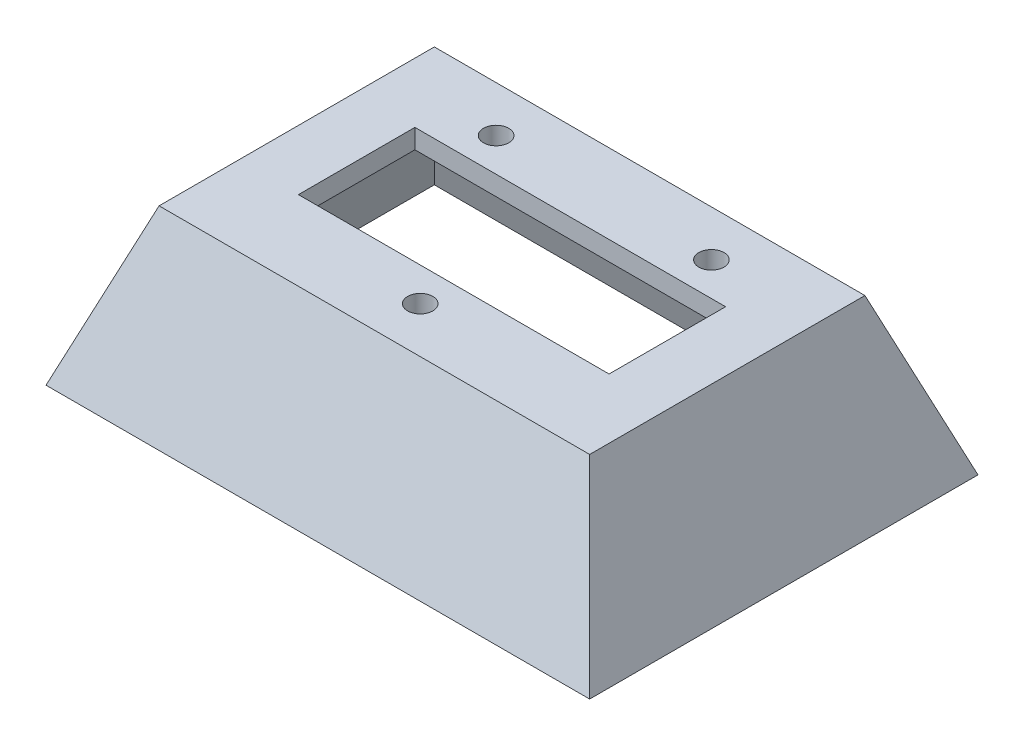
ISO-10303-21;
HEADER;
FILE_DESCRIPTION(('STEP AP214'),'2;1');
FILE_NAME('part.step','',(''),(''),'','','');
FILE_SCHEMA(('AUTOMOTIVE_DESIGN { 1 0 10303 214 1 1 1 1 }'));
ENDSEC;
DATA;
#1=APPLICATION_CONTEXT('core data for automotive mechanical design processes');
#2=APPLICATION_PROTOCOL_DEFINITION('international standard','automotive_design',2000,#1);
#3=PRODUCT_CONTEXT('',#1,'mechanical');
#4=PRODUCT('Part','Part','',(#3));
#5=PRODUCT_RELATED_PRODUCT_CATEGORY('part','',(#4));
#6=PRODUCT_DEFINITION_FORMATION('','',#4);
#7=PRODUCT_DEFINITION_CONTEXT('part definition',#1,'design');
#8=PRODUCT_DEFINITION('design','',#6,#7);
#9=PRODUCT_DEFINITION_SHAPE('','',#8);
#10=(LENGTH_UNIT() NAMED_UNIT(*) SI_UNIT(.MILLI.,.METRE.));
#11=(NAMED_UNIT(*) PLANE_ANGLE_UNIT() SI_UNIT($,.RADIAN.));
#12=(NAMED_UNIT(*) SI_UNIT($,.STERADIAN.) SOLID_ANGLE_UNIT());
#13=UNCERTAINTY_MEASURE_WITH_UNIT(LENGTH_MEASURE(1.E-05),#10,'distance_accuracy_value','');
#14=(GEOMETRIC_REPRESENTATION_CONTEXT(3) GLOBAL_UNCERTAINTY_ASSIGNED_CONTEXT((#13)) GLOBAL_UNIT_ASSIGNED_CONTEXT((#10,
#11,#12)) REPRESENTATION_CONTEXT('',''));
#15=CARTESIAN_POINT('',(0.,0.,0.));
#16=DIRECTION('',(0.,0.,1.));
#17=DIRECTION('',(1.,0.,0.));
#18=AXIS2_PLACEMENT_3D('',#15,#16,#17);
#19=CARTESIAN_POINT('',(0.,0.,0.));
#20=DIRECTION('',(0.,-1.,0.));
#21=DIRECTION('',(0.,0.,-1.));
#22=AXIS2_PLACEMENT_3D('',#19,#20,#21);
#23=PLANE('',#22);
#24=DIRECTION('',(0.,0.,-1.));
#25=VECTOR('',#24,1.);
#26=CARTESIAN_POINT('',(70.,0.,50.));
#27=LINE('',#26,#25);
#28=CARTESIAN_POINT('',(70.,0.,50.));
#29=VERTEX_POINT('',#28);
#30=CARTESIAN_POINT('',(70.,0.,-50.));
#31=VERTEX_POINT('',#30);
#32=EDGE_CURVE('E154',#29,#31,#27,.T.);
#33=ORIENTED_EDGE('',*,*,#32,.F.);
#34=DIRECTION('',(1.,0.,0.));
#35=VECTOR('',#34,1.);
#36=CARTESIAN_POINT('',(-70.,0.,50.));
#37=LINE('',#36,#35);
#38=CARTESIAN_POINT('',(-70.,0.,50.));
#39=VERTEX_POINT('',#38);
#40=EDGE_CURVE('E189',#39,#29,#37,.T.);
#41=ORIENTED_EDGE('',*,*,#40,.F.);
#42=DIRECTION('',(0.,0.,1.));
#43=VECTOR('',#42,1.);
#44=CARTESIAN_POINT('',(-70.,0.,50.));
#45=LINE('',#44,#43);
#46=CARTESIAN_POINT('',(-70.,0.,-50.));
#47=VERTEX_POINT('',#46);
#48=EDGE_CURVE('E187',#47,#39,#45,.T.);
#49=ORIENTED_EDGE('',*,*,#48,.F.);
#50=DIRECTION('',(-1.,0.,0.));
#51=VECTOR('',#50,1.);
#52=CARTESIAN_POINT('',(-70.,0.,-50.));
#53=LINE('',#52,#51);
#54=EDGE_CURVE('E185',#31,#47,#53,.T.);
#55=ORIENTED_EDGE('',*,*,#54,.F.);
#56=EDGE_LOOP('',(#33,#41,#49,#55));
#57=FACE_BOUND('',#56,.T.);
#58=DIRECTION('',(-1.,0.,0.));
#59=VECTOR('',#58,1.);
#60=CARTESIAN_POINT('',(0.,0.,44.6791111376204));
#61=LINE('',#60,#59);
#62=CARTESIAN_POINT('',(-64.6791111376204,0.,44.6791111376205));
#63=VERTEX_POINT('',#62);
#64=CARTESIAN_POINT('',(64.6791111376205,0.,44.6791111376205));
#65=VERTEX_POINT('',#64);
#66=EDGE_CURVE('E160',#63,#65,#61,.F.);
#67=ORIENTED_EDGE('',*,*,#66,.T.);
#68=DIRECTION('',(0.,0.,1.));
#69=VECTOR('',#68,1.);
#70=CARTESIAN_POINT('',(64.6791111376204,0.,0.));
#71=LINE('',#70,#69);
#72=CARTESIAN_POINT('',(64.6791111376205,0.,-44.6791111376204));
#73=VERTEX_POINT('',#72);
#74=EDGE_CURVE('E172',#65,#73,#71,.F.);
#75=ORIENTED_EDGE('',*,*,#74,.T.);
#76=DIRECTION('',(1.,0.,0.));
#77=VECTOR('',#76,1.);
#78=CARTESIAN_POINT('',(0.,0.,-44.6791111376204));
#79=LINE('',#78,#77);
#80=CARTESIAN_POINT('',(-64.6791111376204,0.,-44.6791111376204));
#81=VERTEX_POINT('',#80);
#82=EDGE_CURVE('E175',#73,#81,#79,.F.);
#83=ORIENTED_EDGE('',*,*,#82,.T.);
#84=DIRECTION('',(0.,0.,-1.));
#85=VECTOR('',#84,1.);
#86=CARTESIAN_POINT('',(-64.6791111376204,0.,0.));
#87=LINE('',#86,#85);
#88=EDGE_CURVE('E178',#81,#63,#87,.F.);
#89=ORIENTED_EDGE('',*,*,#88,.T.);
#90=EDGE_LOOP('',(#67,#75,#83,#89));
#91=FACE_BOUND('',#90,.T.);
#92=ADVANCED_FACE('F32',(#57,#91),#23,.T.);
#93=CARTESIAN_POINT('',(70.,0.,50.));
#94=DIRECTION('',(0.939692620785908,0.34202014332567,0.));
#95=DIRECTION('',(-0.34202014332567,0.939692620785908,0.));
#96=AXIS2_PLACEMENT_3D('',#93,#94,#95);
#97=PLANE('',#96);
#98=ORIENTED_EDGE('',*,*,#32,.T.);
#99=DIRECTION('',(0.323615577118186,-0.889126490715988,-0.323615577118186));
#100=VECTOR('',#99,1.);
#101=CARTESIAN_POINT('',(55.3382141545049,40.282925539377,-35.3382141545049));
#102=LINE('',#101,#100);
#103=CARTESIAN_POINT('',(55.4411906293519,40.,-35.4411906293518));
#104=VERTEX_POINT('',#103);
#105=EDGE_CURVE('E192',#104,#31,#102,.T.);
#106=ORIENTED_EDGE('',*,*,#105,.F.);
#107=DIRECTION('',(0.,0.,1.));
#108=VECTOR('',#107,1.);
#109=CARTESIAN_POINT('',(55.4411906293519,40.,0.));
#110=LINE('',#109,#108);
#111=CARTESIAN_POINT('',(55.4411906293519,40.,35.4411906293519));
#112=VERTEX_POINT('',#111);
#113=EDGE_CURVE('E191',#112,#104,#110,.F.);
#114=ORIENTED_EDGE('',*,*,#113,.F.);
#115=DIRECTION('',(0.323615577118186,-0.889126490715988,0.323615577118186));
#116=VECTOR('',#115,1.);
#117=CARTESIAN_POINT('',(70.,0.,50.));
#118=LINE('',#117,#116);
#119=EDGE_CURVE('E197',#112,#29,#118,.T.);
#120=ORIENTED_EDGE('',*,*,#119,.T.);
#121=EDGE_LOOP('',(#98,#106,#114,#120));
#122=FACE_BOUND('',#121,.T.);
#123=ADVANCED_FACE('F265',(#122),#97,.T.);
#124=CARTESIAN_POINT('',(-70.,0.,-50.));
#125=DIRECTION('',(0.,0.34202014332567,-0.939692620785908));
#126=DIRECTION('',(0.,0.939692620785908,0.34202014332567));
#127=AXIS2_PLACEMENT_3D('',#124,#125,#126);
#128=PLANE('',#127);
#129=ORIENTED_EDGE('',*,*,#54,.T.);
#130=DIRECTION('',(-0.323615577118186,-0.889126490715988,-0.323615577118186));
#131=VECTOR('',#130,1.);
#132=CARTESIAN_POINT('',(-59.5272958246464,28.7735182424121,-39.5272958246464));
#133=LINE('',#132,#131);
#134=CARTESIAN_POINT('',(-55.4411906293518,40.,-35.4411906293518));
#135=VERTEX_POINT('',#134);
#136=EDGE_CURVE('E196',#135,#47,#133,.T.);
#137=ORIENTED_EDGE('',*,*,#136,.F.);
#138=DIRECTION('',(1.,0.,0.));
#139=VECTOR('',#138,1.);
#140=CARTESIAN_POINT('',(0.,40.,-35.4411906293518));
#141=LINE('',#140,#139);
#142=EDGE_CURVE('E208',#104,#135,#141,.F.);
#143=ORIENTED_EDGE('',*,*,#142,.F.);
#144=ORIENTED_EDGE('',*,*,#105,.T.);
#145=EDGE_LOOP('',(#129,#137,#143,#144));
#146=FACE_BOUND('',#145,.T.);
#147=ADVANCED_FACE('F34',(#146),#128,.T.);
#148=CARTESIAN_POINT('',(-70.,0.,50.));
#149=DIRECTION('',(-0.939692620785908,0.34202014332567,0.));
#150=DIRECTION('',(-0.34202014332567,-0.939692620785908,0.));
#151=AXIS2_PLACEMENT_3D('',#148,#149,#150);
#152=PLANE('',#151);
#153=ORIENTED_EDGE('',*,*,#48,.T.);
#154=DIRECTION('',(-0.323615577118186,-0.889126490715988,0.323615577118186));
#155=VECTOR('',#154,1.);
#156=CARTESIAN_POINT('',(-70.,0.,50.));
#157=LINE('',#156,#155);
#158=CARTESIAN_POINT('',(-55.4411906293518,40.,35.4411906293519));
#159=VERTEX_POINT('',#158);
#160=EDGE_CURVE('E200',#159,#39,#157,.T.);
#161=ORIENTED_EDGE('',*,*,#160,.F.);
#162=DIRECTION('',(0.,0.,-1.));
#163=VECTOR('',#162,1.);
#164=CARTESIAN_POINT('',(-55.4411906293518,40.,0.));
#165=LINE('',#164,#163);
#166=EDGE_CURVE('E210',#135,#159,#165,.F.);
#167=ORIENTED_EDGE('',*,*,#166,.F.);
#168=ORIENTED_EDGE('',*,*,#136,.T.);
#169=EDGE_LOOP('',(#153,#161,#167,#168));
#170=FACE_BOUND('',#169,.T.);
#171=ADVANCED_FACE('F278',(#170),#152,.T.);
#172=CARTESIAN_POINT('',(-70.,0.,50.));
#173=DIRECTION('',(0.,0.34202014332567,0.939692620785908));
#174=DIRECTION('',(0.,-0.939692620785908,0.34202014332567));
#175=AXIS2_PLACEMENT_3D('',#172,#173,#174);
#176=PLANE('',#175);
#177=ORIENTED_EDGE('',*,*,#40,.T.);
#178=ORIENTED_EDGE('',*,*,#119,.F.);
#179=DIRECTION('',(-1.,0.,0.));
#180=VECTOR('',#179,1.);
#181=CARTESIAN_POINT('',(0.,40.,35.4411906293519));
#182=LINE('',#181,#180);
#183=EDGE_CURVE('E201',#159,#112,#182,.F.);
#184=ORIENTED_EDGE('',*,*,#183,.F.);
#185=ORIENTED_EDGE('',*,*,#160,.T.);
#186=EDGE_LOOP('',(#177,#178,#184,#185));
#187=FACE_BOUND('',#186,.T.);
#188=ADVANCED_FACE('F276',(#187),#176,.T.);
#189=CARTESIAN_POINT('',(0.,40.,0.));
#190=DIRECTION('',(0.,-1.,0.));
#191=DIRECTION('',(0.,0.,-1.));
#192=AXIS2_PLACEMENT_3D('',#189,#190,#191);
#193=PLANE('',#192);
#194=CARTESIAN_POINT('',(0.,40.,23.6311906293518));
#195=DIRECTION('',(0.,1.,0.));
#196=DIRECTION('',(0.,0.,1.));
#197=AXIS2_PLACEMENT_3D('',#194,#195,#196);
#198=CIRCLE('',#197,3.25);
#199=CARTESIAN_POINT('',(0.,40.,26.8811906293518));
#200=VERTEX_POINT('',#199);
#201=EDGE_CURVE('E305',#200,#200,#198,.T.);
#202=ORIENTED_EDGE('',*,*,#201,.F.);
#203=EDGE_LOOP('',(#202));
#204=FACE_BOUND('',#203,.T.);
#205=CARTESIAN_POINT('',(27.7205953146759,40.,-23.6311906293518));
#206=DIRECTION('',(0.,1.,0.));
#207=DIRECTION('',(0.,0.,1.));
#208=AXIS2_PLACEMENT_3D('',#205,#206,#207);
#209=CIRCLE('',#208,3.25);
#210=CARTESIAN_POINT('',(27.7205953146759,40.,-20.3811906293518));
#211=VERTEX_POINT('',#210);
#212=EDGE_CURVE('E309',#211,#211,#209,.T.);
#213=ORIENTED_EDGE('',*,*,#212,.F.);
#214=EDGE_LOOP('',(#213));
#215=FACE_BOUND('',#214,.T.);
#216=CARTESIAN_POINT('',(-27.7205953146759,40.,-23.6311906293518));
#217=DIRECTION('',(0.,1.,0.));
#218=DIRECTION('',(0.,0.,1.));
#219=AXIS2_PLACEMENT_3D('',#216,#217,#218);
#220=CIRCLE('',#219,3.25);
#221=CARTESIAN_POINT('',(-27.7205953146759,40.,-20.3811906293518));
#222=VERTEX_POINT('',#221);
#223=EDGE_CURVE('E312',#222,#222,#220,.T.);
#224=ORIENTED_EDGE('',*,*,#223,.F.);
#225=EDGE_LOOP('',(#224));
#226=FACE_BOUND('',#225,.T.);
#227=DIRECTION('',(0.,0.,-1.));
#228=VECTOR('',#227,1.);
#229=CARTESIAN_POINT('',(40.,40.,0.));
#230=LINE('',#229,#228);
#231=CARTESIAN_POINT('',(40.,40.,15.));
#232=VERTEX_POINT('',#231);
#233=CARTESIAN_POINT('',(40.,40.,-15.));
#234=VERTEX_POINT('',#233);
#235=EDGE_CURVE('E134',#232,#234,#230,.T.);
#236=ORIENTED_EDGE('',*,*,#235,.F.);
#237=DIRECTION('',(1.,0.,0.));
#238=VECTOR('',#237,1.);
#239=CARTESIAN_POINT('',(0.,40.,15.));
#240=LINE('',#239,#238);
#241=CARTESIAN_POINT('',(-40.,40.,15.));
#242=VERTEX_POINT('',#241);
#243=EDGE_CURVE('E49',#242,#232,#240,.T.);
#244=ORIENTED_EDGE('',*,*,#243,.F.);
#245=DIRECTION('',(0.,0.,-1.));
#246=VECTOR('',#245,1.);
#247=CARTESIAN_POINT('',(-40.,40.,0.));
#248=LINE('',#247,#246);
#249=CARTESIAN_POINT('',(-40.,40.,-15.));
#250=VERTEX_POINT('',#249);
#251=EDGE_CURVE('E141',#242,#250,#248,.T.);
#252=ORIENTED_EDGE('',*,*,#251,.T.);
#253=DIRECTION('',(1.,0.,0.));
#254=VECTOR('',#253,1.);
#255=CARTESIAN_POINT('',(0.,40.,-15.));
#256=LINE('',#255,#254);
#257=EDGE_CURVE('E125',#250,#234,#256,.T.);
#258=ORIENTED_EDGE('',*,*,#257,.T.);
#259=EDGE_LOOP('',(#236,#244,#252,#258));
#260=FACE_BOUND('',#259,.T.);
#261=ORIENTED_EDGE('',*,*,#113,.T.);
#262=ORIENTED_EDGE('',*,*,#142,.T.);
#263=ORIENTED_EDGE('',*,*,#166,.T.);
#264=ORIENTED_EDGE('',*,*,#183,.T.);
#265=EDGE_LOOP('',(#261,#262,#263,#264));
#266=FACE_BOUND('',#265,.T.);
#267=ADVANCED_FACE('F138',(#204,#215,#226,#260,#266),#193,.F.);
#268=CARTESIAN_POINT('',(65.3015368960705,-1.71010071662835,50.));
#269=DIRECTION('',(0.939692620785908,0.34202014332567,0.));
#270=DIRECTION('',(-0.34202014332567,0.939692620785908,0.));
#271=AXIS2_PLACEMENT_3D('',#268,#269,#270);
#272=PLANE('',#271);
#273=ORIENTED_EDGE('',*,*,#74,.F.);
#274=DIRECTION('',(0.323615577118186,-0.889126490715988,0.323615577118186));
#275=VECTOR('',#274,1.);
#276=CARTESIAN_POINT('',(65.7935930377331,-3.06201385495052,45.7935930377332));
#277=LINE('',#276,#275);
#278=CARTESIAN_POINT('',(51.9401529383033,35.,31.9401529383033));
#279=VERTEX_POINT('',#278);
#280=EDGE_CURVE('E161',#279,#65,#277,.T.);
#281=ORIENTED_EDGE('',*,*,#280,.F.);
#282=DIRECTION('',(0.,0.,1.));
#283=VECTOR('',#282,1.);
#284=CARTESIAN_POINT('',(51.9401529383033,35.,0.));
#285=LINE('',#284,#283);
#286=CARTESIAN_POINT('',(51.9401529383033,35.,-31.9401529383033));
#287=VERTEX_POINT('',#286);
#288=EDGE_CURVE('E156',#279,#287,#285,.F.);
#289=ORIENTED_EDGE('',*,*,#288,.T.);
#290=DIRECTION('',(0.323615577118186,-0.889126490715988,-0.323615577118186));
#291=VECTOR('',#290,1.);
#292=CARTESIAN_POINT('',(51.1318071922381,37.2209116844265,-31.1318071922381));
#293=LINE('',#292,#291);
#294=EDGE_CURVE('E151',#287,#73,#293,.T.);
#295=ORIENTED_EDGE('',*,*,#294,.T.);
#296=EDGE_LOOP('',(#273,#281,#289,#295));
#297=FACE_BOUND('',#296,.T.);
#298=ADVANCED_FACE('F246',(#297),#272,.F.);
#299=CARTESIAN_POINT('',(-70.,-1.71010071662835,-45.3015368960705));
#300=DIRECTION('',(0.,0.34202014332567,-0.939692620785908));
#301=DIRECTION('',(0.,0.939692620785908,0.34202014332567));
#302=AXIS2_PLACEMENT_3D('',#299,#300,#301);
#303=PLANE('',#302);
#304=ORIENTED_EDGE('',*,*,#82,.F.);
#305=ORIENTED_EDGE('',*,*,#294,.F.);
#306=DIRECTION('',(1.,0.,0.));
#307=VECTOR('',#306,1.);
#308=CARTESIAN_POINT('',(0.,35.,-31.9401529383033));
#309=LINE('',#308,#307);
#310=CARTESIAN_POINT('',(-51.9401529383033,35.,-31.9401529383033));
#311=VERTEX_POINT('',#310);
#312=EDGE_CURVE('E159',#287,#311,#309,.F.);
#313=ORIENTED_EDGE('',*,*,#312,.T.);
#314=DIRECTION('',(-0.323615577118186,-0.889126490715988,-0.323615577118186));
#315=VECTOR('',#314,1.);
#316=CARTESIAN_POINT('',(-55.3208888623795,25.7115043874616,-35.3208888623795));
#317=LINE('',#316,#315);
#318=EDGE_CURVE('E155',#311,#81,#317,.T.);
#319=ORIENTED_EDGE('',*,*,#318,.T.);
#320=EDGE_LOOP('',(#304,#305,#313,#319));
#321=FACE_BOUND('',#320,.T.);
#322=ADVANCED_FACE('F248',(#321),#303,.F.);
#323=CARTESIAN_POINT('',(-65.3015368960704,-1.71010071662835,50.));
#324=DIRECTION('',(-0.939692620785908,0.34202014332567,0.));
#325=DIRECTION('',(-0.34202014332567,-0.939692620785908,0.));
#326=AXIS2_PLACEMENT_3D('',#323,#324,#325);
#327=PLANE('',#326);
#328=ORIENTED_EDGE('',*,*,#88,.F.);
#329=ORIENTED_EDGE('',*,*,#318,.F.);
#330=DIRECTION('',(0.,0.,-1.));
#331=VECTOR('',#330,1.);
#332=CARTESIAN_POINT('',(-51.9401529383033,35.,0.));
#333=LINE('',#332,#331);
#334=CARTESIAN_POINT('',(-51.9401529383033,35.,31.9401529383033));
#335=VERTEX_POINT('',#334);
#336=EDGE_CURVE('E168',#311,#335,#333,.F.);
#337=ORIENTED_EDGE('',*,*,#336,.T.);
#338=DIRECTION('',(-0.323615577118186,-0.889126490715988,0.323615577118186));
#339=VECTOR('',#338,1.);
#340=CARTESIAN_POINT('',(-65.7935930377331,-3.06201385495052,45.7935930377332));
#341=LINE('',#340,#339);
#342=EDGE_CURVE('E163',#335,#63,#341,.T.);
#343=ORIENTED_EDGE('',*,*,#342,.T.);
#344=EDGE_LOOP('',(#328,#329,#337,#343));
#345=FACE_BOUND('',#344,.T.);
#346=ADVANCED_FACE('F255',(#345),#327,.F.);
#347=CARTESIAN_POINT('',(-70.,-1.71010071662835,45.3015368960705));
#348=DIRECTION('',(0.,0.34202014332567,0.939692620785908));
#349=DIRECTION('',(0.,-0.939692620785908,0.34202014332567));
#350=AXIS2_PLACEMENT_3D('',#347,#348,#349);
#351=PLANE('',#350);
#352=ORIENTED_EDGE('',*,*,#66,.F.);
#353=ORIENTED_EDGE('',*,*,#342,.F.);
#354=DIRECTION('',(-1.,0.,0.));
#355=VECTOR('',#354,1.);
#356=CARTESIAN_POINT('',(0.,35.,31.9401529383033));
#357=LINE('',#356,#355);
#358=EDGE_CURVE('E164',#335,#279,#357,.F.);
#359=ORIENTED_EDGE('',*,*,#358,.T.);
#360=ORIENTED_EDGE('',*,*,#280,.T.);
#361=EDGE_LOOP('',(#352,#353,#359,#360));
#362=FACE_BOUND('',#361,.T.);
#363=ADVANCED_FACE('F232',(#362),#351,.F.);
#364=CARTESIAN_POINT('',(0.,35.,0.));
#365=DIRECTION('',(0.,-1.,0.));
#366=DIRECTION('',(0.,0.,-1.));
#367=AXIS2_PLACEMENT_3D('',#364,#365,#366);
#368=PLANE('',#367);
#369=CARTESIAN_POINT('',(0.,35.,23.6311906293518));
#370=DIRECTION('',(0.,-1.,0.));
#371=DIRECTION('',(0.,0.,-1.));
#372=AXIS2_PLACEMENT_3D('',#369,#370,#371);
#373=CIRCLE('',#372,3.25);
#374=CARTESIAN_POINT('',(0.,35.,26.8811906293518));
#375=VERTEX_POINT('',#374);
#376=EDGE_CURVE('E36',#375,#375,#373,.T.);
#377=ORIENTED_EDGE('',*,*,#376,.F.);
#378=EDGE_LOOP('',(#377));
#379=FACE_BOUND('',#378,.T.);
#380=CARTESIAN_POINT('',(27.7205953146759,35.,-23.6311906293518));
#381=DIRECTION('',(0.,-1.,0.));
#382=DIRECTION('',(0.,0.,-1.));
#383=AXIS2_PLACEMENT_3D('',#380,#381,#382);
#384=CIRCLE('',#383,3.25);
#385=CARTESIAN_POINT('',(27.7205953146759,35.,-20.3811906293518));
#386=VERTEX_POINT('',#385);
#387=EDGE_CURVE('E218',#386,#386,#384,.T.);
#388=ORIENTED_EDGE('',*,*,#387,.F.);
#389=EDGE_LOOP('',(#388));
#390=FACE_BOUND('',#389,.T.);
#391=CARTESIAN_POINT('',(-27.7205953146759,35.,-23.6311906293518));
#392=DIRECTION('',(0.,-1.,0.));
#393=DIRECTION('',(0.,0.,-1.));
#394=AXIS2_PLACEMENT_3D('',#391,#392,#393);
#395=CIRCLE('',#394,3.25);
#396=CARTESIAN_POINT('',(-27.7205953146759,35.,-20.3811906293518));
#397=VERTEX_POINT('',#396);
#398=EDGE_CURVE('E148',#397,#397,#395,.T.);
#399=ORIENTED_EDGE('',*,*,#398,.F.);
#400=EDGE_LOOP('',(#399));
#401=FACE_BOUND('',#400,.T.);
#402=DIRECTION('',(-1.,0.,0.));
#403=VECTOR('',#402,1.);
#404=CARTESIAN_POINT('',(0.,35.,15.));
#405=LINE('',#404,#403);
#406=CARTESIAN_POINT('',(40.,35.,15.));
#407=VERTEX_POINT('',#406);
#408=CARTESIAN_POINT('',(-40.,35.,15.));
#409=VERTEX_POINT('',#408);
#410=EDGE_CURVE('E11',#407,#409,#405,.T.);
#411=ORIENTED_EDGE('',*,*,#410,.F.);
#412=DIRECTION('',(0.,0.,1.));
#413=VECTOR('',#412,1.);
#414=CARTESIAN_POINT('',(40.,35.,0.));
#415=LINE('',#414,#413);
#416=CARTESIAN_POINT('',(40.,35.,-15.));
#417=VERTEX_POINT('',#416);
#418=EDGE_CURVE('E195',#417,#407,#415,.T.);
#419=ORIENTED_EDGE('',*,*,#418,.F.);
#420=DIRECTION('',(-1.,0.,0.));
#421=VECTOR('',#420,1.);
#422=CARTESIAN_POINT('',(0.,35.,-15.));
#423=LINE('',#422,#421);
#424=CARTESIAN_POINT('',(-40.,35.,-15.));
#425=VERTEX_POINT('',#424);
#426=EDGE_CURVE('E128',#417,#425,#423,.T.);
#427=ORIENTED_EDGE('',*,*,#426,.T.);
#428=DIRECTION('',(0.,0.,1.));
#429=VECTOR('',#428,1.);
#430=CARTESIAN_POINT('',(-40.,35.,0.));
#431=LINE('',#430,#429);
#432=EDGE_CURVE('E41',#425,#409,#431,.T.);
#433=ORIENTED_EDGE('',*,*,#432,.T.);
#434=EDGE_LOOP('',(#411,#419,#427,#433));
#435=FACE_BOUND('',#434,.T.);
#436=ORIENTED_EDGE('',*,*,#288,.F.);
#437=ORIENTED_EDGE('',*,*,#358,.F.);
#438=ORIENTED_EDGE('',*,*,#336,.F.);
#439=ORIENTED_EDGE('',*,*,#312,.F.);
#440=EDGE_LOOP('',(#436,#437,#438,#439));
#441=FACE_BOUND('',#440,.T.);
#442=ADVANCED_FACE('F228',(#379,#390,#401,#435,#441),#368,.T.);
#443=CARTESIAN_POINT('',(0.,0.,15.));
#444=DIRECTION('',(0.,0.,1.));
#445=DIRECTION('',(1.,0.,0.));
#446=AXIS2_PLACEMENT_3D('',#443,#444,#445);
#447=PLANE('',#446);
#448=ORIENTED_EDGE('',*,*,#410,.T.);
#449=DIRECTION('',(0.,1.,0.));
#450=VECTOR('',#449,1.);
#451=CARTESIAN_POINT('',(-40.,0.,15.));
#452=LINE('',#451,#450);
#453=EDGE_CURVE('E146',#409,#242,#452,.T.);
#454=ORIENTED_EDGE('',*,*,#453,.T.);
#455=ORIENTED_EDGE('',*,*,#243,.T.);
#456=DIRECTION('',(0.,1.,0.));
#457=VECTOR('',#456,1.);
#458=CARTESIAN_POINT('',(40.,0.,15.));
#459=LINE('',#458,#457);
#460=EDGE_CURVE('E131',#407,#232,#459,.T.);
#461=ORIENTED_EDGE('',*,*,#460,.F.);
#462=EDGE_LOOP('',(#448,#454,#455,#461));
#463=FACE_BOUND('',#462,.T.);
#464=ADVANCED_FACE('F231',(#463),#447,.F.);
#465=CARTESIAN_POINT('',(-40.,0.,0.));
#466=DIRECTION('',(1.,0.,0.));
#467=DIRECTION('',(0.,0.,-1.));
#468=AXIS2_PLACEMENT_3D('',#465,#466,#467);
#469=PLANE('',#468);
#470=DIRECTION('',(0.,1.,0.));
#471=VECTOR('',#470,1.);
#472=CARTESIAN_POINT('',(-40.,0.,-15.));
#473=LINE('',#472,#471);
#474=EDGE_CURVE('E130',#425,#250,#473,.T.);
#475=ORIENTED_EDGE('',*,*,#474,.T.);
#476=ORIENTED_EDGE('',*,*,#251,.F.);
#477=ORIENTED_EDGE('',*,*,#453,.F.);
#478=ORIENTED_EDGE('',*,*,#432,.F.);
#479=EDGE_LOOP('',(#475,#476,#477,#478));
#480=FACE_BOUND('',#479,.T.);
#481=ADVANCED_FACE('F327',(#480),#469,.T.);
#482=CARTESIAN_POINT('',(0.,0.,-15.));
#483=DIRECTION('',(0.,0.,1.));
#484=DIRECTION('',(1.,0.,0.));
#485=AXIS2_PLACEMENT_3D('',#482,#483,#484);
#486=PLANE('',#485);
#487=DIRECTION('',(0.,1.,0.));
#488=VECTOR('',#487,1.);
#489=CARTESIAN_POINT('',(40.,0.,-15.));
#490=LINE('',#489,#488);
#491=EDGE_CURVE('E57',#417,#234,#490,.T.);
#492=ORIENTED_EDGE('',*,*,#491,.T.);
#493=ORIENTED_EDGE('',*,*,#257,.F.);
#494=ORIENTED_EDGE('',*,*,#474,.F.);
#495=ORIENTED_EDGE('',*,*,#426,.F.);
#496=EDGE_LOOP('',(#492,#493,#494,#495));
#497=FACE_BOUND('',#496,.T.);
#498=ADVANCED_FACE('F122',(#497),#486,.T.);
#499=CARTESIAN_POINT('',(40.,0.,0.));
#500=DIRECTION('',(1.,0.,0.));
#501=DIRECTION('',(0.,0.,-1.));
#502=AXIS2_PLACEMENT_3D('',#499,#500,#501);
#503=PLANE('',#502);
#504=ORIENTED_EDGE('',*,*,#418,.T.);
#505=ORIENTED_EDGE('',*,*,#460,.T.);
#506=ORIENTED_EDGE('',*,*,#235,.T.);
#507=ORIENTED_EDGE('',*,*,#491,.F.);
#508=EDGE_LOOP('',(#504,#505,#506,#507));
#509=FACE_BOUND('',#508,.T.);
#510=ADVANCED_FACE('F135',(#509),#503,.F.);
#511=CARTESIAN_POINT('',(-27.7205953146759,0.,-23.6311906293518));
#512=DIRECTION('',(0.,1.,0.));
#513=DIRECTION('',(0.,0.,1.));
#514=AXIS2_PLACEMENT_3D('',#511,#512,#513);
#515=CYLINDRICAL_SURFACE('',#514,3.25);
#516=CARTESIAN_POINT('',(-27.7205953146759,35.,-20.3811906293518));
#517=CARTESIAN_POINT('',(-27.7205953146759,35.0520833333334,-20.3811906293518));
#518=CARTESIAN_POINT('',(-27.7205953146759,35.1041666666667,-20.3811906293518));
#519=CARTESIAN_POINT('',(-27.7205953146759,35.2083333333334,-20.3811906293518));
#520=CARTESIAN_POINT('',(-27.7205953146759,35.2604166666667,-20.3811906293518));
#521=CARTESIAN_POINT('',(-27.7205953146759,35.3645833333334,-20.3811906293518));
#522=CARTESIAN_POINT('',(-27.7205953146759,35.4166666666667,-20.3811906293518));
#523=CARTESIAN_POINT('',(-27.7205953146759,35.5208333333334,-20.3811906293518));
#524=CARTESIAN_POINT('',(-27.7205953146759,35.5729166666667,-20.3811906293518));
#525=CARTESIAN_POINT('',(-27.7205953146759,35.6770833333334,-20.3811906293518));
#526=CARTESIAN_POINT('',(-27.7205953146759,35.7291666666667,-20.3811906293518));
#527=CARTESIAN_POINT('',(-27.7205953146759,35.8333333333334,-20.3811906293518));
#528=CARTESIAN_POINT('',(-27.7205953146759,35.8854166666667,-20.3811906293518));
#529=CARTESIAN_POINT('',(-27.7205953146759,35.9895833333334,-20.3811906293518));
#530=CARTESIAN_POINT('',(-27.7205953146759,36.0416666666667,-20.3811906293518));
#531=CARTESIAN_POINT('',(-27.7205953146759,36.1458333333334,-20.3811906293518));
#532=CARTESIAN_POINT('',(-27.7205953146759,36.1979166666667,-20.3811906293518));
#533=CARTESIAN_POINT('',(-27.7205953146759,36.3020833333334,-20.3811906293518));
#534=CARTESIAN_POINT('',(-27.7205953146759,36.3541666666667,-20.3811906293518));
#535=CARTESIAN_POINT('',(-27.7205953146759,36.4583333333334,-20.3811906293518));
#536=CARTESIAN_POINT('',(-27.7205953146759,36.5104166666667,-20.3811906293518));
#537=CARTESIAN_POINT('',(-27.7205953146759,36.6145833333333,-20.3811906293518));
#538=CARTESIAN_POINT('',(-27.7205953146759,36.6666666666667,-20.3811906293518));
#539=CARTESIAN_POINT('',(-27.7205953146759,36.7708333333334,-20.3811906293518));
#540=CARTESIAN_POINT('',(-27.7205953146759,36.8229166666667,-20.3811906293518));
#541=CARTESIAN_POINT('',(-27.7205953146759,36.9270833333333,-20.3811906293518));
#542=CARTESIAN_POINT('',(-27.7205953146759,36.9791666666667,-20.3811906293518));
#543=CARTESIAN_POINT('',(-27.7205953146759,37.0833333333334,-20.3811906293518));
#544=CARTESIAN_POINT('',(-27.7205953146759,37.1354166666667,-20.3811906293518));
#545=CARTESIAN_POINT('',(-27.7205953146759,37.2395833333334,-20.3811906293518));
#546=CARTESIAN_POINT('',(-27.7205953146759,37.2916666666667,-20.3811906293518));
#547=CARTESIAN_POINT('',(-27.7205953146759,37.3958333333334,-20.3811906293518));
#548=CARTESIAN_POINT('',(-27.7205953146759,37.4479166666667,-20.3811906293518));
#549=CARTESIAN_POINT('',(-27.7205953146759,37.5520833333334,-20.3811906293518));
#550=CARTESIAN_POINT('',(-27.7205953146759,37.6041666666667,-20.3811906293518));
#551=CARTESIAN_POINT('',(-27.7205953146759,37.7083333333333,-20.3811906293518));
#552=CARTESIAN_POINT('',(-27.7205953146759,37.7604166666667,-20.3811906293518));
#553=CARTESIAN_POINT('',(-27.7205953146759,37.8645833333334,-20.3811906293518));
#554=CARTESIAN_POINT('',(-27.7205953146759,37.9166666666667,-20.3811906293518));
#555=CARTESIAN_POINT('',(-27.7205953146759,38.0208333333333,-20.3811906293518));
#556=CARTESIAN_POINT('',(-27.7205953146759,38.0729166666667,-20.3811906293518));
#557=CARTESIAN_POINT('',(-27.7205953146759,38.1770833333334,-20.3811906293518));
#558=CARTESIAN_POINT('',(-27.7205953146759,38.2291666666667,-20.3811906293518));
#559=CARTESIAN_POINT('',(-27.7205953146759,38.3333333333333,-20.3811906293518));
#560=CARTESIAN_POINT('',(-27.7205953146759,38.3854166666667,-20.3811906293518));
#561=CARTESIAN_POINT('',(-27.7205953146759,38.4895833333334,-20.3811906293518));
#562=CARTESIAN_POINT('',(-27.7205953146759,38.5416666666667,-20.3811906293518));
#563=CARTESIAN_POINT('',(-27.7205953146759,38.6458333333333,-20.3811906293518));
#564=CARTESIAN_POINT('',(-27.7205953146759,38.6979166666667,-20.3811906293518));
#565=CARTESIAN_POINT('',(-27.7205953146759,38.8020833333333,-20.3811906293518));
#566=CARTESIAN_POINT('',(-27.7205953146759,38.8541666666667,-20.3811906293518));
#567=CARTESIAN_POINT('',(-27.7205953146759,38.9583333333333,-20.3811906293518));
#568=CARTESIAN_POINT('',(-27.7205953146759,39.0104166666667,-20.3811906293518));
#569=CARTESIAN_POINT('',(-27.7205953146759,39.1145833333333,-20.3811906293518));
#570=CARTESIAN_POINT('',(-27.7205953146759,39.1666666666667,-20.3811906293518));
#571=CARTESIAN_POINT('',(-27.7205953146759,39.2708333333333,-20.3811906293518));
#572=CARTESIAN_POINT('',(-27.7205953146759,39.3229166666667,-20.3811906293518));
#573=CARTESIAN_POINT('',(-27.7205953146759,39.4270833333333,-20.3811906293518));
#574=CARTESIAN_POINT('',(-27.7205953146759,39.4791666666667,-20.3811906293518));
#575=CARTESIAN_POINT('',(-27.7205953146759,39.5833333333333,-20.3811906293518));
#576=CARTESIAN_POINT('',(-27.7205953146759,39.6354166666667,-20.3811906293518));
#577=CARTESIAN_POINT('',(-27.7205953146759,39.7395833333333,-20.3811906293518));
#578=CARTESIAN_POINT('',(-27.7205953146759,39.7916666666667,-20.3811906293518));
#579=CARTESIAN_POINT('',(-27.7205953146759,39.8958333333333,-20.3811906293518));
#580=CARTESIAN_POINT('',(-27.7205953146759,39.9479166666667,-20.3811906293518));
#581=CARTESIAN_POINT('',(-27.7205953146759,40.,-20.3811906293518));
#582=B_SPLINE_CURVE_WITH_KNOTS('',3,(#516,#517,#518,#519,#520,#521,#522,#523,#524,#525,#526,
#527,#528,#529,#530,#531,#532,#533,#534,#535,#536,#537,#538,#539,#540,#541,#542,#543,#544,#545,
#546,#547,#548,#549,#550,#551,#552,#553,#554,#555,#556,#557,#558,#559,#560,#561,#562,#563,#564,
#565,#566,#567,#568,#569,#570,#571,#572,#573,#574,#575,#576,#577,#578,#579,#580,#581),
.UNSPECIFIED.,.F.,.F.,(4,2,2,2,2,2,2,2,2,2,2,2,2,2,2,2,2,2,2,2,2,2,2,2,2,2,2,2,2,2,2,2,4),(0.,
0.156249999999997,0.3125,0.468749999999997,0.625000000000001,0.781249999999997,
0.937500000000001,1.09375,1.25,1.40625,1.56249999999999,1.71875,1.87499999999999,2.03125,2.1875,
2.34375,2.5,2.65624999999999,2.8125,2.96874999999999,3.125,3.28124999999999,3.4375,
3.59374999999999,3.74999999999999,3.90624999999999,4.06249999999999,4.21874999999999,
4.37499999999999,4.53124999999999,4.68749999999999,4.84374999999999,4.99999999999999),.UNSPECIFIED.);
#583=EDGE_CURVE('BSEAM323',#397,#222,#582,.T.);
#584=ORIENTED_EDGE('',*,*,#398,.T.);
#585=ORIENTED_EDGE('',*,*,#223,.T.);
#586=ORIENTED_EDGE('',*,*,#583,.T.);
#587=ORIENTED_EDGE('',*,*,#583,.F.);
#588=EDGE_LOOP('',(#584,#586,#585,#587));
#589=FACE_BOUND('',#588,.T.);
#590=ADVANCED_FACE('F323',(#589),#515,.F.);
#591=CARTESIAN_POINT('',(27.7205953146759,0.,-23.6311906293518));
#592=DIRECTION('',(0.,1.,0.));
#593=DIRECTION('',(0.,0.,1.));
#594=AXIS2_PLACEMENT_3D('',#591,#592,#593);
#595=CYLINDRICAL_SURFACE('',#594,3.25);
#596=CARTESIAN_POINT('',(27.7205953146759,35.,-20.3811906293518));
#597=CARTESIAN_POINT('',(27.7205953146759,35.0520833333334,-20.3811906293518));
#598=CARTESIAN_POINT('',(27.7205953146759,35.1041666666667,-20.3811906293518));
#599=CARTESIAN_POINT('',(27.7205953146759,35.2083333333334,-20.3811906293518));
#600=CARTESIAN_POINT('',(27.7205953146759,35.2604166666667,-20.3811906293518));
#601=CARTESIAN_POINT('',(27.7205953146759,35.3645833333334,-20.3811906293518));
#602=CARTESIAN_POINT('',(27.7205953146759,35.4166666666667,-20.3811906293518));
#603=CARTESIAN_POINT('',(27.7205953146759,35.5208333333334,-20.3811906293518));
#604=CARTESIAN_POINT('',(27.7205953146759,35.5729166666667,-20.3811906293518));
#605=CARTESIAN_POINT('',(27.7205953146759,35.6770833333334,-20.3811906293518));
#606=CARTESIAN_POINT('',(27.7205953146759,35.7291666666667,-20.3811906293518));
#607=CARTESIAN_POINT('',(27.7205953146759,35.8333333333334,-20.3811906293518));
#608=CARTESIAN_POINT('',(27.7205953146759,35.8854166666667,-20.3811906293518));
#609=CARTESIAN_POINT('',(27.7205953146759,35.9895833333334,-20.3811906293518));
#610=CARTESIAN_POINT('',(27.7205953146759,36.0416666666667,-20.3811906293518));
#611=CARTESIAN_POINT('',(27.7205953146759,36.1458333333334,-20.3811906293518));
#612=CARTESIAN_POINT('',(27.7205953146759,36.1979166666667,-20.3811906293518));
#613=CARTESIAN_POINT('',(27.7205953146759,36.3020833333334,-20.3811906293518));
#614=CARTESIAN_POINT('',(27.7205953146759,36.3541666666667,-20.3811906293518));
#615=CARTESIAN_POINT('',(27.7205953146759,36.4583333333334,-20.3811906293518));
#616=CARTESIAN_POINT('',(27.7205953146759,36.5104166666667,-20.3811906293518));
#617=CARTESIAN_POINT('',(27.7205953146759,36.6145833333333,-20.3811906293518));
#618=CARTESIAN_POINT('',(27.7205953146759,36.6666666666667,-20.3811906293518));
#619=CARTESIAN_POINT('',(27.7205953146759,36.7708333333334,-20.3811906293518));
#620=CARTESIAN_POINT('',(27.7205953146759,36.8229166666667,-20.3811906293518));
#621=CARTESIAN_POINT('',(27.7205953146759,36.9270833333333,-20.3811906293518));
#622=CARTESIAN_POINT('',(27.7205953146759,36.9791666666667,-20.3811906293518));
#623=CARTESIAN_POINT('',(27.7205953146759,37.0833333333334,-20.3811906293518));
#624=CARTESIAN_POINT('',(27.7205953146759,37.1354166666667,-20.3811906293518));
#625=CARTESIAN_POINT('',(27.7205953146759,37.2395833333334,-20.3811906293518));
#626=CARTESIAN_POINT('',(27.7205953146759,37.2916666666667,-20.3811906293518));
#627=CARTESIAN_POINT('',(27.7205953146759,37.3958333333334,-20.3811906293518));
#628=CARTESIAN_POINT('',(27.7205953146759,37.4479166666667,-20.3811906293518));
#629=CARTESIAN_POINT('',(27.7205953146759,37.5520833333334,-20.3811906293518));
#630=CARTESIAN_POINT('',(27.7205953146759,37.6041666666667,-20.3811906293518));
#631=CARTESIAN_POINT('',(27.7205953146759,37.7083333333333,-20.3811906293518));
#632=CARTESIAN_POINT('',(27.7205953146759,37.7604166666667,-20.3811906293518));
#633=CARTESIAN_POINT('',(27.7205953146759,37.8645833333334,-20.3811906293518));
#634=CARTESIAN_POINT('',(27.7205953146759,37.9166666666667,-20.3811906293518));
#635=CARTESIAN_POINT('',(27.7205953146759,38.0208333333333,-20.3811906293518));
#636=CARTESIAN_POINT('',(27.7205953146759,38.0729166666667,-20.3811906293518));
#637=CARTESIAN_POINT('',(27.7205953146759,38.1770833333334,-20.3811906293518));
#638=CARTESIAN_POINT('',(27.7205953146759,38.2291666666667,-20.3811906293518));
#639=CARTESIAN_POINT('',(27.7205953146759,38.3333333333333,-20.3811906293518));
#640=CARTESIAN_POINT('',(27.7205953146759,38.3854166666667,-20.3811906293518));
#641=CARTESIAN_POINT('',(27.7205953146759,38.4895833333334,-20.3811906293518));
#642=CARTESIAN_POINT('',(27.7205953146759,38.5416666666667,-20.3811906293518));
#643=CARTESIAN_POINT('',(27.7205953146759,38.6458333333333,-20.3811906293518));
#644=CARTESIAN_POINT('',(27.7205953146759,38.6979166666667,-20.3811906293518));
#645=CARTESIAN_POINT('',(27.7205953146759,38.8020833333333,-20.3811906293518));
#646=CARTESIAN_POINT('',(27.7205953146759,38.8541666666667,-20.3811906293518));
#647=CARTESIAN_POINT('',(27.7205953146759,38.9583333333333,-20.3811906293518));
#648=CARTESIAN_POINT('',(27.7205953146759,39.0104166666667,-20.3811906293518));
#649=CARTESIAN_POINT('',(27.7205953146759,39.1145833333333,-20.3811906293518));
#650=CARTESIAN_POINT('',(27.7205953146759,39.1666666666667,-20.3811906293518));
#651=CARTESIAN_POINT('',(27.7205953146759,39.2708333333333,-20.3811906293518));
#652=CARTESIAN_POINT('',(27.7205953146759,39.3229166666667,-20.3811906293518));
#653=CARTESIAN_POINT('',(27.7205953146759,39.4270833333333,-20.3811906293518));
#654=CARTESIAN_POINT('',(27.7205953146759,39.4791666666667,-20.3811906293518));
#655=CARTESIAN_POINT('',(27.7205953146759,39.5833333333333,-20.3811906293518));
#656=CARTESIAN_POINT('',(27.7205953146759,39.6354166666667,-20.3811906293518));
#657=CARTESIAN_POINT('',(27.7205953146759,39.7395833333333,-20.3811906293518));
#658=CARTESIAN_POINT('',(27.7205953146759,39.7916666666667,-20.3811906293518));
#659=CARTESIAN_POINT('',(27.7205953146759,39.8958333333333,-20.3811906293518));
#660=CARTESIAN_POINT('',(27.7205953146759,39.9479166666667,-20.3811906293518));
#661=CARTESIAN_POINT('',(27.7205953146759,40.,-20.3811906293518));
#662=B_SPLINE_CURVE_WITH_KNOTS('',3,(#596,#597,#598,#599,#600,#601,#602,#603,#604,#605,#606,
#607,#608,#609,#610,#611,#612,#613,#614,#615,#616,#617,#618,#619,#620,#621,#622,#623,#624,#625,
#626,#627,#628,#629,#630,#631,#632,#633,#634,#635,#636,#637,#638,#639,#640,#641,#642,#643,#644,
#645,#646,#647,#648,#649,#650,#651,#652,#653,#654,#655,#656,#657,#658,#659,#660,#661),
.UNSPECIFIED.,.F.,.F.,(4,2,2,2,2,2,2,2,2,2,2,2,2,2,2,2,2,2,2,2,2,2,2,2,2,2,2,2,2,2,2,2,4),(0.,
0.156249999999997,0.3125,0.468749999999997,0.625000000000001,0.781249999999997,
0.937500000000001,1.09375,1.25,1.40625,1.56249999999999,1.71875,1.87499999999999,2.03125,2.1875,
2.34375,2.5,2.65624999999999,2.8125,2.96874999999999,3.125,3.28124999999999,3.4375,
3.59374999999999,3.74999999999999,3.90624999999999,4.06249999999999,4.21874999999999,
4.37499999999999,4.53124999999999,4.68749999999999,4.84374999999999,4.99999999999999),.UNSPECIFIED.);
#663=EDGE_CURVE('BSEAM318',#386,#211,#662,.T.);
#664=ORIENTED_EDGE('',*,*,#387,.T.);
#665=ORIENTED_EDGE('',*,*,#212,.T.);
#666=ORIENTED_EDGE('',*,*,#663,.T.);
#667=ORIENTED_EDGE('',*,*,#663,.F.);
#668=EDGE_LOOP('',(#664,#666,#665,#667));
#669=FACE_BOUND('',#668,.T.);
#670=ADVANCED_FACE('F318',(#669),#595,.F.);
#671=CARTESIAN_POINT('',(0.,0.,23.6311906293518));
#672=DIRECTION('',(0.,1.,0.));
#673=DIRECTION('',(0.,0.,1.));
#674=AXIS2_PLACEMENT_3D('',#671,#672,#673);
#675=CYLINDRICAL_SURFACE('',#674,3.25);
#676=CARTESIAN_POINT('',(0.,35.,26.8811906293518));
#677=CARTESIAN_POINT('',(0.,35.0520833333334,26.8811906293518));
#678=CARTESIAN_POINT('',(0.,35.1041666666667,26.8811906293518));
#679=CARTESIAN_POINT('',(0.,35.2083333333334,26.8811906293518));
#680=CARTESIAN_POINT('',(0.,35.2604166666667,26.8811906293518));
#681=CARTESIAN_POINT('',(0.,35.3645833333334,26.8811906293518));
#682=CARTESIAN_POINT('',(0.,35.4166666666667,26.8811906293518));
#683=CARTESIAN_POINT('',(0.,35.5208333333334,26.8811906293518));
#684=CARTESIAN_POINT('',(0.,35.5729166666667,26.8811906293518));
#685=CARTESIAN_POINT('',(0.,35.6770833333334,26.8811906293518));
#686=CARTESIAN_POINT('',(0.,35.7291666666667,26.8811906293518));
#687=CARTESIAN_POINT('',(0.,35.8333333333334,26.8811906293518));
#688=CARTESIAN_POINT('',(0.,35.8854166666667,26.8811906293518));
#689=CARTESIAN_POINT('',(0.,35.9895833333334,26.8811906293518));
#690=CARTESIAN_POINT('',(0.,36.0416666666667,26.8811906293518));
#691=CARTESIAN_POINT('',(0.,36.1458333333334,26.8811906293518));
#692=CARTESIAN_POINT('',(0.,36.1979166666667,26.8811906293518));
#693=CARTESIAN_POINT('',(0.,36.3020833333334,26.8811906293518));
#694=CARTESIAN_POINT('',(0.,36.3541666666667,26.8811906293518));
#695=CARTESIAN_POINT('',(0.,36.4583333333334,26.8811906293518));
#696=CARTESIAN_POINT('',(0.,36.5104166666667,26.8811906293518));
#697=CARTESIAN_POINT('',(0.,36.6145833333333,26.8811906293518));
#698=CARTESIAN_POINT('',(0.,36.6666666666667,26.8811906293518));
#699=CARTESIAN_POINT('',(0.,36.7708333333334,26.8811906293518));
#700=CARTESIAN_POINT('',(0.,36.8229166666667,26.8811906293518));
#701=CARTESIAN_POINT('',(0.,36.9270833333333,26.8811906293518));
#702=CARTESIAN_POINT('',(0.,36.9791666666667,26.8811906293518));
#703=CARTESIAN_POINT('',(0.,37.0833333333334,26.8811906293518));
#704=CARTESIAN_POINT('',(0.,37.1354166666667,26.8811906293518));
#705=CARTESIAN_POINT('',(0.,37.2395833333334,26.8811906293518));
#706=CARTESIAN_POINT('',(0.,37.2916666666667,26.8811906293518));
#707=CARTESIAN_POINT('',(0.,37.3958333333334,26.8811906293518));
#708=CARTESIAN_POINT('',(0.,37.4479166666667,26.8811906293518));
#709=CARTESIAN_POINT('',(0.,37.5520833333334,26.8811906293518));
#710=CARTESIAN_POINT('',(0.,37.6041666666667,26.8811906293518));
#711=CARTESIAN_POINT('',(0.,37.7083333333333,26.8811906293518));
#712=CARTESIAN_POINT('',(0.,37.7604166666667,26.8811906293518));
#713=CARTESIAN_POINT('',(0.,37.8645833333334,26.8811906293518));
#714=CARTESIAN_POINT('',(0.,37.9166666666667,26.8811906293518));
#715=CARTESIAN_POINT('',(0.,38.0208333333333,26.8811906293518));
#716=CARTESIAN_POINT('',(0.,38.0729166666667,26.8811906293518));
#717=CARTESIAN_POINT('',(0.,38.1770833333334,26.8811906293518));
#718=CARTESIAN_POINT('',(0.,38.2291666666667,26.8811906293518));
#719=CARTESIAN_POINT('',(0.,38.3333333333333,26.8811906293518));
#720=CARTESIAN_POINT('',(0.,38.3854166666667,26.8811906293518));
#721=CARTESIAN_POINT('',(0.,38.4895833333334,26.8811906293518));
#722=CARTESIAN_POINT('',(0.,38.5416666666667,26.8811906293518));
#723=CARTESIAN_POINT('',(0.,38.6458333333333,26.8811906293518));
#724=CARTESIAN_POINT('',(0.,38.6979166666667,26.8811906293518));
#725=CARTESIAN_POINT('',(0.,38.8020833333333,26.8811906293518));
#726=CARTESIAN_POINT('',(0.,38.8541666666667,26.8811906293518));
#727=CARTESIAN_POINT('',(0.,38.9583333333333,26.8811906293518));
#728=CARTESIAN_POINT('',(0.,39.0104166666667,26.8811906293518));
#729=CARTESIAN_POINT('',(0.,39.1145833333333,26.8811906293518));
#730=CARTESIAN_POINT('',(0.,39.1666666666667,26.8811906293518));
#731=CARTESIAN_POINT('',(0.,39.2708333333333,26.8811906293518));
#732=CARTESIAN_POINT('',(0.,39.3229166666667,26.8811906293518));
#733=CARTESIAN_POINT('',(0.,39.4270833333333,26.8811906293518));
#734=CARTESIAN_POINT('',(0.,39.4791666666667,26.8811906293518));
#735=CARTESIAN_POINT('',(0.,39.5833333333333,26.8811906293518));
#736=CARTESIAN_POINT('',(0.,39.6354166666667,26.8811906293518));
#737=CARTESIAN_POINT('',(0.,39.7395833333333,26.8811906293518));
#738=CARTESIAN_POINT('',(0.,39.7916666666667,26.8811906293518));
#739=CARTESIAN_POINT('',(0.,39.8958333333333,26.8811906293518));
#740=CARTESIAN_POINT('',(0.,39.9479166666667,26.8811906293518));
#741=CARTESIAN_POINT('',(0.,40.,26.8811906293518));
#742=B_SPLINE_CURVE_WITH_KNOTS('',3,(#676,#677,#678,#679,#680,#681,#682,#683,#684,#685,#686,
#687,#688,#689,#690,#691,#692,#693,#694,#695,#696,#697,#698,#699,#700,#701,#702,#703,#704,#705,
#706,#707,#708,#709,#710,#711,#712,#713,#714,#715,#716,#717,#718,#719,#720,#721,#722,#723,#724,
#725,#726,#727,#728,#729,#730,#731,#732,#733,#734,#735,#736,#737,#738,#739,#740,#741),
.UNSPECIFIED.,.F.,.F.,(4,2,2,2,2,2,2,2,2,2,2,2,2,2,2,2,2,2,2,2,2,2,2,2,2,2,2,2,2,2,2,2,4),(0.,
0.156249999999997,0.3125,0.468749999999997,0.625000000000001,0.781249999999997,
0.937500000000001,1.09375,1.25,1.40625,1.56249999999999,1.71875,1.87499999999999,2.03125,2.1875,
2.34375,2.5,2.65624999999999,2.8125,2.96874999999999,3.125,3.28124999999999,3.4375,
3.59374999999999,3.74999999999999,3.90624999999999,4.06249999999999,4.21874999999999,
4.37499999999999,4.53124999999999,4.68749999999999,4.84374999999999,4.99999999999999),.UNSPECIFIED.);
#743=EDGE_CURVE('BSEAM225',#375,#200,#742,.T.);
#744=ORIENTED_EDGE('',*,*,#376,.T.);
#745=ORIENTED_EDGE('',*,*,#201,.T.);
#746=ORIENTED_EDGE('',*,*,#743,.T.);
#747=ORIENTED_EDGE('',*,*,#743,.F.);
#748=EDGE_LOOP('',(#744,#746,#745,#747));
#749=FACE_BOUND('',#748,.T.);
#750=ADVANCED_FACE('F225',(#749),#675,.F.);
#751=CLOSED_SHELL('',(#92,#123,#147,#171,#188,#267,#298,#322,#346,#363,#442,#464,#481,#498,#510,
#590,#670,#750));
#752=MANIFOLD_SOLID_BREP('B2',#751);
#753=ADVANCED_BREP_SHAPE_REPRESENTATION('',(#18,#752),#14);
#754=SHAPE_DEFINITION_REPRESENTATION(#9,#753);
ENDSEC;
END-ISO-10303-21;
